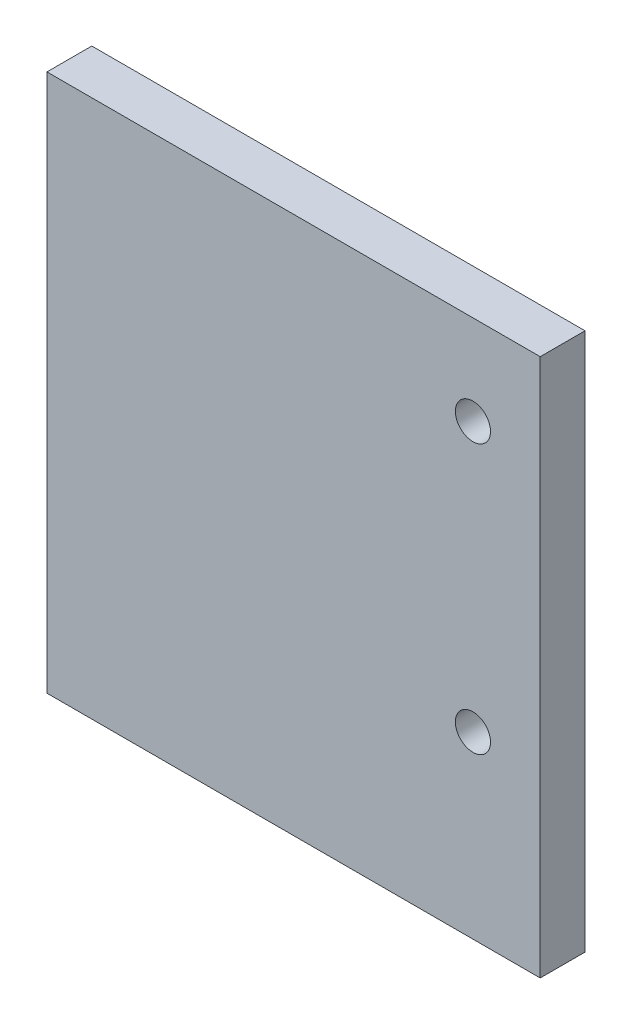
ISO-10303-21;
HEADER;
FILE_DESCRIPTION(('STEP AP214'),'2;1');
FILE_NAME('part.step','',(''),(''),'','','');
FILE_SCHEMA(('AUTOMOTIVE_DESIGN { 1 0 10303 214 1 1 1 1 }'));
ENDSEC;
DATA;
#1=APPLICATION_CONTEXT('core data for automotive mechanical design processes');
#2=APPLICATION_PROTOCOL_DEFINITION('international standard','automotive_design',2000,#1);
#3=PRODUCT_CONTEXT('',#1,'mechanical');
#4=PRODUCT('Part','Part','',(#3));
#5=PRODUCT_RELATED_PRODUCT_CATEGORY('part','',(#4));
#6=PRODUCT_DEFINITION_FORMATION('','',#4);
#7=PRODUCT_DEFINITION_CONTEXT('part definition',#1,'design');
#8=PRODUCT_DEFINITION('design','',#6,#7);
#9=PRODUCT_DEFINITION_SHAPE('','',#8);
#10=(LENGTH_UNIT() NAMED_UNIT(*) SI_UNIT(.MILLI.,.METRE.));
#11=(NAMED_UNIT(*) PLANE_ANGLE_UNIT() SI_UNIT($,.RADIAN.));
#12=(NAMED_UNIT(*) SI_UNIT($,.STERADIAN.) SOLID_ANGLE_UNIT());
#13=UNCERTAINTY_MEASURE_WITH_UNIT(LENGTH_MEASURE(1.E-05),#10,'distance_accuracy_value','');
#14=(GEOMETRIC_REPRESENTATION_CONTEXT(3) GLOBAL_UNCERTAINTY_ASSIGNED_CONTEXT((#13)) GLOBAL_UNIT_ASSIGNED_CONTEXT((#10,
#11,#12)) REPRESENTATION_CONTEXT('',''));
#15=CARTESIAN_POINT('',(0.,0.,0.));
#16=DIRECTION('',(0.,0.,1.));
#17=DIRECTION('',(1.,0.,0.));
#18=AXIS2_PLACEMENT_3D('',#15,#16,#17);
#19=CARTESIAN_POINT('',(0.,0.,3.175));
#20=DIRECTION('',(0.,0.,1.));
#21=DIRECTION('',(1.,0.,0.));
#22=AXIS2_PLACEMENT_3D('',#19,#20,#21);
#23=PLANE('',#22);
#24=CARTESIAN_POINT('',(25.4,25.4,3.175));
#25=DIRECTION('',(0.,0.,1.));
#26=DIRECTION('',(1.,0.,0.));
#27=AXIS2_PLACEMENT_3D('',#24,#25,#26);
#28=CIRCLE('',#27,2.4892);
#29=CARTESIAN_POINT('',(27.8892,25.4,3.175));
#30=VERTEX_POINT('',#29);
#31=EDGE_CURVE('E114',#30,#30,#28,.T.);
#32=ORIENTED_EDGE('',*,*,#31,.F.);
#33=EDGE_LOOP('',(#32));
#34=FACE_BOUND('',#33,.T.);
#35=DIRECTION('',(0.,-1.,0.));
#36=VECTOR('',#35,1.);
#37=CARTESIAN_POINT('',(-34.925,38.1,3.175));
#38=LINE('',#37,#36);
#39=CARTESIAN_POINT('',(-34.925,38.1,3.175));
#40=VERTEX_POINT('',#39);
#41=CARTESIAN_POINT('',(-34.925,-38.1,3.175));
#42=VERTEX_POINT('',#41);
#43=EDGE_CURVE('E94',#40,#42,#38,.T.);
#44=ORIENTED_EDGE('',*,*,#43,.T.);
#45=DIRECTION('',(1.,0.,0.));
#46=VECTOR('',#45,1.);
#47=CARTESIAN_POINT('',(-34.925,-38.1,3.175));
#48=LINE('',#47,#46);
#49=CARTESIAN_POINT('',(34.925,-38.1,3.175));
#50=VERTEX_POINT('',#49);
#51=EDGE_CURVE('E89',#42,#50,#48,.T.);
#52=ORIENTED_EDGE('',*,*,#51,.T.);
#53=DIRECTION('',(0.,1.,0.));
#54=VECTOR('',#53,1.);
#55=CARTESIAN_POINT('',(34.925,38.1,3.175));
#56=LINE('',#55,#54);
#57=CARTESIAN_POINT('',(34.925,38.1,3.175));
#58=VERTEX_POINT('',#57);
#59=EDGE_CURVE('E92',#50,#58,#56,.T.);
#60=ORIENTED_EDGE('',*,*,#59,.T.);
#61=DIRECTION('',(-1.,0.,0.));
#62=VECTOR('',#61,1.);
#63=CARTESIAN_POINT('',(-34.925,38.1,3.175));
#64=LINE('',#63,#62);
#65=EDGE_CURVE('E59',#58,#40,#64,.T.);
#66=ORIENTED_EDGE('',*,*,#65,.T.);
#67=EDGE_LOOP('',(#44,#52,#60,#66));
#68=FACE_BOUND('',#67,.T.);
#69=CARTESIAN_POINT('',(25.4,-12.7,3.175));
#70=DIRECTION('',(0.,0.,1.));
#71=DIRECTION('',(1.,0.,0.));
#72=AXIS2_PLACEMENT_3D('',#69,#70,#71);
#73=CIRCLE('',#72,2.4892);
#74=CARTESIAN_POINT('',(27.8892,-12.7,3.175));
#75=VERTEX_POINT('',#74);
#76=EDGE_CURVE('E136',#75,#75,#73,.T.);
#77=ORIENTED_EDGE('',*,*,#76,.F.);
#78=EDGE_LOOP('',(#77));
#79=FACE_BOUND('',#78,.T.);
#80=ADVANCED_FACE('F41',(#34,#68,#79),#23,.T.);
#81=CARTESIAN_POINT('',(0.,0.,-3.175));
#82=DIRECTION('',(0.,0.,1.));
#83=DIRECTION('',(1.,0.,0.));
#84=AXIS2_PLACEMENT_3D('',#81,#82,#83);
#85=PLANE('',#84);
#86=DIRECTION('',(0.,-1.,0.));
#87=VECTOR('',#86,1.);
#88=CARTESIAN_POINT('',(-34.925,38.1,-3.175));
#89=LINE('',#88,#87);
#90=CARTESIAN_POINT('',(-34.925,38.1,-3.175));
#91=VERTEX_POINT('',#90);
#92=CARTESIAN_POINT('',(-34.925,-38.1,-3.175));
#93=VERTEX_POINT('',#92);
#94=EDGE_CURVE('E110',#91,#93,#89,.T.);
#95=ORIENTED_EDGE('',*,*,#94,.F.);
#96=DIRECTION('',(-1.,0.,0.));
#97=VECTOR('',#96,1.);
#98=CARTESIAN_POINT('',(-34.925,38.1,-3.175));
#99=LINE('',#98,#97);
#100=CARTESIAN_POINT('',(34.925,38.1,-3.175));
#101=VERTEX_POINT('',#100);
#102=EDGE_CURVE('E82',#101,#91,#99,.T.);
#103=ORIENTED_EDGE('',*,*,#102,.F.);
#104=DIRECTION('',(0.,1.,0.));
#105=VECTOR('',#104,1.);
#106=CARTESIAN_POINT('',(34.925,38.1,-3.175));
#107=LINE('',#106,#105);
#108=CARTESIAN_POINT('',(34.925,-38.1,-3.175));
#109=VERTEX_POINT('',#108);
#110=EDGE_CURVE('E76',#109,#101,#107,.T.);
#111=ORIENTED_EDGE('',*,*,#110,.F.);
#112=DIRECTION('',(1.,0.,0.));
#113=VECTOR('',#112,1.);
#114=CARTESIAN_POINT('',(-34.925,-38.1,-3.175));
#115=LINE('',#114,#113);
#116=EDGE_CURVE('E99',#93,#109,#115,.T.);
#117=ORIENTED_EDGE('',*,*,#116,.F.);
#118=EDGE_LOOP('',(#95,#103,#111,#117));
#119=FACE_BOUND('',#118,.T.);
#120=CARTESIAN_POINT('',(25.4,25.4,-3.175));
#121=DIRECTION('',(0.,0.,1.));
#122=DIRECTION('',(1.,0.,0.));
#123=AXIS2_PLACEMENT_3D('',#120,#121,#122);
#124=CIRCLE('',#123,2.4892);
#125=CARTESIAN_POINT('',(27.8892,25.4,-3.175));
#126=VERTEX_POINT('',#125);
#127=EDGE_CURVE('E132',#126,#126,#124,.T.);
#128=ORIENTED_EDGE('',*,*,#127,.T.);
#129=EDGE_LOOP('',(#128));
#130=FACE_BOUND('',#129,.T.);
#131=CARTESIAN_POINT('',(25.4,-12.7,-3.175));
#132=DIRECTION('',(0.,0.,1.));
#133=DIRECTION('',(1.,0.,0.));
#134=AXIS2_PLACEMENT_3D('',#131,#132,#133);
#135=CIRCLE('',#134,2.4892);
#136=CARTESIAN_POINT('',(27.8892,-12.7,-3.175));
#137=VERTEX_POINT('',#136);
#138=EDGE_CURVE('E140',#137,#137,#135,.T.);
#139=ORIENTED_EDGE('',*,*,#138,.T.);
#140=EDGE_LOOP('',(#139));
#141=FACE_BOUND('',#140,.T.);
#142=ADVANCED_FACE('F127',(#119,#130,#141),#85,.F.);
#143=CARTESIAN_POINT('',(-34.925,38.1,3.175));
#144=DIRECTION('',(1.,0.,0.));
#145=DIRECTION('',(0.,0.,-1.));
#146=AXIS2_PLACEMENT_3D('',#143,#144,#145);
#147=PLANE('',#146);
#148=ORIENTED_EDGE('',*,*,#94,.T.);
#149=DIRECTION('',(0.,0.,-1.));
#150=VECTOR('',#149,1.);
#151=CARTESIAN_POINT('',(-34.925,-38.1,3.175));
#152=LINE('',#151,#150);
#153=EDGE_CURVE('E11',#42,#93,#152,.T.);
#154=ORIENTED_EDGE('',*,*,#153,.F.);
#155=ORIENTED_EDGE('',*,*,#43,.F.);
#156=DIRECTION('',(0.,0.,-1.));
#157=VECTOR('',#156,1.);
#158=CARTESIAN_POINT('',(-34.925,38.1,3.175));
#159=LINE('',#158,#157);
#160=EDGE_CURVE('E106',#40,#91,#159,.T.);
#161=ORIENTED_EDGE('',*,*,#160,.T.);
#162=EDGE_LOOP('',(#148,#154,#155,#161));
#163=FACE_BOUND('',#162,.T.);
#164=ADVANCED_FACE('F43',(#163),#147,.F.);
#165=CARTESIAN_POINT('',(-34.925,-38.1,3.175));
#166=DIRECTION('',(0.,1.,0.));
#167=DIRECTION('',(0.,0.,1.));
#168=AXIS2_PLACEMENT_3D('',#165,#166,#167);
#169=PLANE('',#168);
#170=ORIENTED_EDGE('',*,*,#116,.T.);
#171=DIRECTION('',(0.,0.,-1.));
#172=VECTOR('',#171,1.);
#173=CARTESIAN_POINT('',(34.925,-38.1,3.175));
#174=LINE('',#173,#172);
#175=EDGE_CURVE('E51',#50,#109,#174,.T.);
#176=ORIENTED_EDGE('',*,*,#175,.F.);
#177=ORIENTED_EDGE('',*,*,#51,.F.);
#178=ORIENTED_EDGE('',*,*,#153,.T.);
#179=EDGE_LOOP('',(#170,#176,#177,#178));
#180=FACE_BOUND('',#179,.T.);
#181=ADVANCED_FACE('F98',(#180),#169,.F.);
#182=CARTESIAN_POINT('',(34.925,38.1,3.175));
#183=DIRECTION('',(-1.,0.,0.));
#184=DIRECTION('',(0.,-1.,0.));
#185=AXIS2_PLACEMENT_3D('',#182,#183,#184);
#186=PLANE('',#185);
#187=ORIENTED_EDGE('',*,*,#110,.T.);
#188=DIRECTION('',(0.,0.,-1.));
#189=VECTOR('',#188,1.);
#190=CARTESIAN_POINT('',(34.925,38.1,3.175));
#191=LINE('',#190,#189);
#192=EDGE_CURVE('E101',#58,#101,#191,.T.);
#193=ORIENTED_EDGE('',*,*,#192,.F.);
#194=ORIENTED_EDGE('',*,*,#59,.F.);
#195=ORIENTED_EDGE('',*,*,#175,.T.);
#196=EDGE_LOOP('',(#187,#193,#194,#195));
#197=FACE_BOUND('',#196,.T.);
#198=ADVANCED_FACE('F102',(#197),#186,.F.);
#199=CARTESIAN_POINT('',(-34.925,38.1,3.175));
#200=DIRECTION('',(0.,-1.,0.));
#201=DIRECTION('',(0.,0.,-1.));
#202=AXIS2_PLACEMENT_3D('',#199,#200,#201);
#203=PLANE('',#202);
#204=ORIENTED_EDGE('',*,*,#102,.T.);
#205=ORIENTED_EDGE('',*,*,#160,.F.);
#206=ORIENTED_EDGE('',*,*,#65,.F.);
#207=ORIENTED_EDGE('',*,*,#192,.T.);
#208=EDGE_LOOP('',(#204,#205,#206,#207));
#209=FACE_BOUND('',#208,.T.);
#210=ADVANCED_FACE('F124',(#209),#203,.F.);
#211=CARTESIAN_POINT('',(25.4,25.4,3.175));
#212=DIRECTION('',(0.,0.,-1.));
#213=DIRECTION('',(-1.,0.,0.));
#214=AXIS2_PLACEMENT_3D('',#211,#212,#213);
#215=CYLINDRICAL_SURFACE('',#214,2.4892);
#216=ORIENTED_EDGE('',*,*,#31,.T.);
#217=EDGE_LOOP('',(#216));
#218=FACE_BOUND('',#217,.T.);
#219=ORIENTED_EDGE('',*,*,#127,.F.);
#220=EDGE_LOOP('',(#219));
#221=FACE_BOUND('',#220,.T.);
#222=ADVANCED_FACE('F159',(#218,#221),#215,.F.);
#223=CARTESIAN_POINT('',(25.4,-12.7,3.175));
#224=DIRECTION('',(0.,0.,-1.));
#225=DIRECTION('',(-1.,0.,0.));
#226=AXIS2_PLACEMENT_3D('',#223,#224,#225);
#227=CYLINDRICAL_SURFACE('',#226,2.4892);
#228=ORIENTED_EDGE('',*,*,#76,.T.);
#229=EDGE_LOOP('',(#228));
#230=FACE_BOUND('',#229,.T.);
#231=ORIENTED_EDGE('',*,*,#138,.F.);
#232=EDGE_LOOP('',(#231));
#233=FACE_BOUND('',#232,.T.);
#234=ADVANCED_FACE('F148',(#230,#233),#227,.F.);
#235=CLOSED_SHELL('',(#80,#142,#164,#181,#198,#210,#222,#234));
#236=MANIFOLD_SOLID_BREP('B2',#235);
#237=ADVANCED_BREP_SHAPE_REPRESENTATION('',(#18,#236),#14);
#238=SHAPE_DEFINITION_REPRESENTATION(#9,#237);
ENDSEC;
END-ISO-10303-21;
